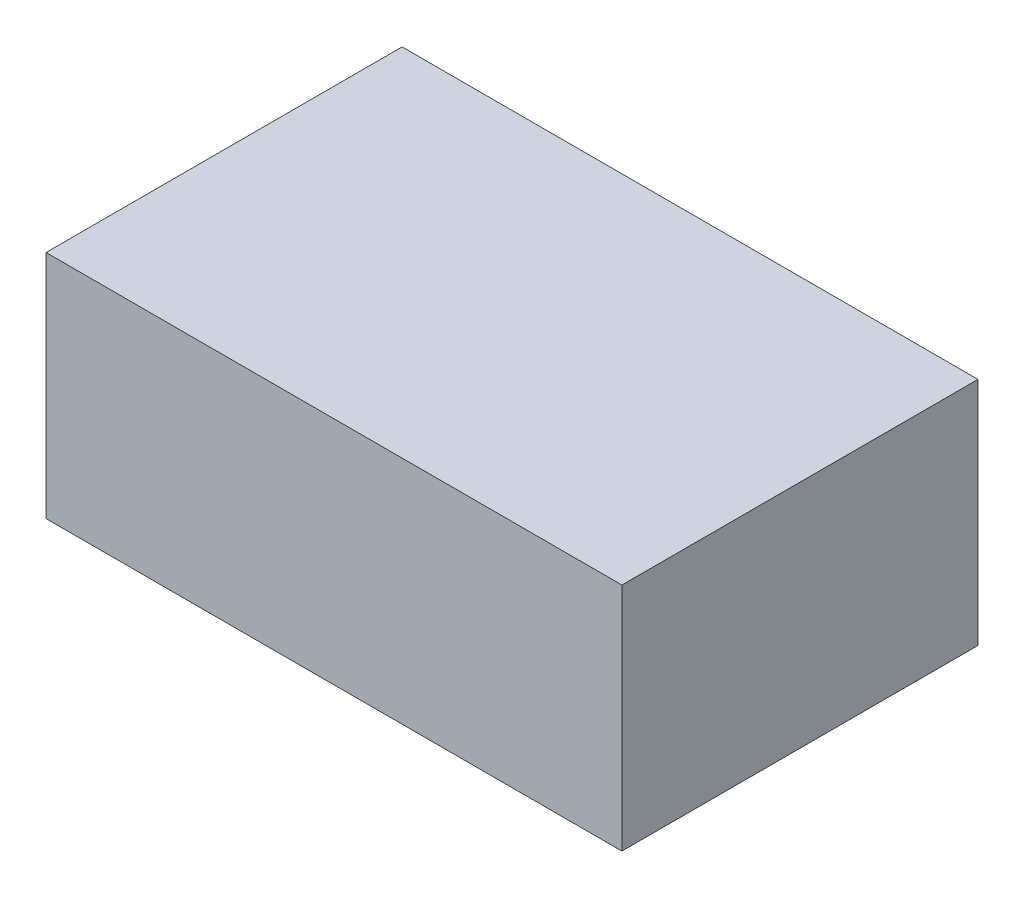
ISO-10303-21;
HEADER;
FILE_DESCRIPTION(('STEP AP214'),'2;1');
FILE_NAME('part.step','',(''),(''),'','','');
FILE_SCHEMA(('AUTOMOTIVE_DESIGN { 1 0 10303 214 1 1 1 1 }'));
ENDSEC;
DATA;
#1=APPLICATION_CONTEXT('core data for automotive mechanical design processes');
#2=APPLICATION_PROTOCOL_DEFINITION('international standard','automotive_design',2000,#1);
#3=PRODUCT_CONTEXT('',#1,'mechanical');
#4=PRODUCT('Part','Part','',(#3));
#5=PRODUCT_RELATED_PRODUCT_CATEGORY('part','',(#4));
#6=PRODUCT_DEFINITION_FORMATION('','',#4);
#7=PRODUCT_DEFINITION_CONTEXT('part definition',#1,'design');
#8=PRODUCT_DEFINITION('design','',#6,#7);
#9=PRODUCT_DEFINITION_SHAPE('','',#8);
#10=(LENGTH_UNIT() NAMED_UNIT(*) SI_UNIT(.MILLI.,.METRE.));
#11=(NAMED_UNIT(*) PLANE_ANGLE_UNIT() SI_UNIT($,.RADIAN.));
#12=(NAMED_UNIT(*) SI_UNIT($,.STERADIAN.) SOLID_ANGLE_UNIT());
#13=UNCERTAINTY_MEASURE_WITH_UNIT(LENGTH_MEASURE(1.E-05),#10,'distance_accuracy_value','');
#14=(GEOMETRIC_REPRESENTATION_CONTEXT(3) GLOBAL_UNCERTAINTY_ASSIGNED_CONTEXT((#13)) GLOBAL_UNIT_ASSIGNED_CONTEXT((#10,
#11,#12)) REPRESENTATION_CONTEXT('',''));
#15=CARTESIAN_POINT('',(0.,0.,0.));
#16=DIRECTION('',(0.,0.,1.));
#17=DIRECTION('',(1.,0.,0.));
#18=AXIS2_PLACEMENT_3D('',#15,#16,#17);
#19=CARTESIAN_POINT('',(0.,63.5,-98.1221280754162));
#20=DIRECTION('',(1.,0.,0.));
#21=DIRECTION('',(0.,0.,-1.));
#22=AXIS2_PLACEMENT_3D('',#19,#20,#21);
#23=PLANE('',#22);
#24=DIRECTION('',(0.,0.,1.));
#25=VECTOR('',#24,1.);
#26=CARTESIAN_POINT('',(0.,0.,-98.1221280754162));
#27=LINE('',#26,#25);
#28=CARTESIAN_POINT('',(0.,0.,-98.1221280754162));
#29=VERTEX_POINT('',#28);
#30=CARTESIAN_POINT('',(0.,0.,0.));
#31=VERTEX_POINT('',#30);
#32=EDGE_CURVE('E101',#29,#31,#27,.T.);
#33=ORIENTED_EDGE('',*,*,#32,.T.);
#34=DIRECTION('',(0.,-1.,0.));
#35=VECTOR('',#34,1.);
#36=CARTESIAN_POINT('',(0.,63.5,0.));
#37=LINE('',#36,#35);
#38=CARTESIAN_POINT('',(0.,63.5,0.));
#39=VERTEX_POINT('',#38);
#40=EDGE_CURVE('E11',#39,#31,#37,.T.);
#41=ORIENTED_EDGE('',*,*,#40,.F.);
#42=DIRECTION('',(0.,0.,1.));
#43=VECTOR('',#42,1.);
#44=CARTESIAN_POINT('',(0.,63.5,-98.1221280754162));
#45=LINE('',#44,#43);
#46=CARTESIAN_POINT('',(0.,63.5,-98.1221280754162));
#47=VERTEX_POINT('',#46);
#48=EDGE_CURVE('E89',#47,#39,#45,.T.);
#49=ORIENTED_EDGE('',*,*,#48,.F.);
#50=DIRECTION('',(0.,-1.,0.));
#51=VECTOR('',#50,1.);
#52=CARTESIAN_POINT('',(0.,63.5,-98.1221280754162));
#53=LINE('',#52,#51);
#54=EDGE_CURVE('E97',#47,#29,#53,.T.);
#55=ORIENTED_EDGE('',*,*,#54,.T.);
#56=EDGE_LOOP('',(#33,#41,#49,#55));
#57=FACE_BOUND('',#56,.T.);
#58=ADVANCED_FACE('F38',(#57),#23,.F.);
#59=CARTESIAN_POINT('',(0.,63.5,0.));
#60=DIRECTION('',(0.,0.,-1.));
#61=DIRECTION('',(-1.,0.,0.));
#62=AXIS2_PLACEMENT_3D('',#59,#60,#61);
#63=PLANE('',#62);
#64=DIRECTION('',(1.,0.,0.));
#65=VECTOR('',#64,1.);
#66=CARTESIAN_POINT('',(0.,0.,0.));
#67=LINE('',#66,#65);
#68=CARTESIAN_POINT('',(158.685463524729,0.,0.));
#69=VERTEX_POINT('',#68);
#70=EDGE_CURVE('E93',#31,#69,#67,.T.);
#71=ORIENTED_EDGE('',*,*,#70,.T.);
#72=DIRECTION('',(0.,-1.,0.));
#73=VECTOR('',#72,1.);
#74=CARTESIAN_POINT('',(158.685463524729,63.5,0.));
#75=LINE('',#74,#73);
#76=CARTESIAN_POINT('',(158.685463524729,63.5,0.));
#77=VERTEX_POINT('',#76);
#78=EDGE_CURVE('E46',#77,#69,#75,.T.);
#79=ORIENTED_EDGE('',*,*,#78,.F.);
#80=DIRECTION('',(1.,0.,0.));
#81=VECTOR('',#80,1.);
#82=CARTESIAN_POINT('',(0.,63.5,0.));
#83=LINE('',#82,#81);
#84=EDGE_CURVE('E84',#39,#77,#83,.T.);
#85=ORIENTED_EDGE('',*,*,#84,.F.);
#86=ORIENTED_EDGE('',*,*,#40,.T.);
#87=EDGE_LOOP('',(#71,#79,#85,#86));
#88=FACE_BOUND('',#87,.T.);
#89=ADVANCED_FACE('F92',(#88),#63,.F.);
#90=CARTESIAN_POINT('',(158.685463524729,63.5,-98.1221280754162));
#91=DIRECTION('',(-1.,0.,0.));
#92=DIRECTION('',(0.,0.,1.));
#93=AXIS2_PLACEMENT_3D('',#90,#91,#92);
#94=PLANE('',#93);
#95=DIRECTION('',(0.,0.,-1.));
#96=VECTOR('',#95,1.);
#97=CARTESIAN_POINT('',(158.685463524729,0.,-98.1221280754162));
#98=LINE('',#97,#96);
#99=CARTESIAN_POINT('',(158.685463524729,0.,-98.1221280754162));
#100=VERTEX_POINT('',#99);
#101=EDGE_CURVE('E71',#69,#100,#98,.T.);
#102=ORIENTED_EDGE('',*,*,#101,.T.);
#103=DIRECTION('',(0.,-1.,0.));
#104=VECTOR('',#103,1.);
#105=CARTESIAN_POINT('',(158.685463524729,63.5,-98.1221280754162));
#106=LINE('',#105,#104);
#107=CARTESIAN_POINT('',(158.685463524729,63.5,-98.1221280754162));
#108=VERTEX_POINT('',#107);
#109=EDGE_CURVE('E94',#108,#100,#106,.T.);
#110=ORIENTED_EDGE('',*,*,#109,.F.);
#111=DIRECTION('',(0.,0.,-1.));
#112=VECTOR('',#111,1.);
#113=CARTESIAN_POINT('',(158.685463524729,63.5,-98.1221280754162));
#114=LINE('',#113,#112);
#115=EDGE_CURVE('E87',#77,#108,#114,.T.);
#116=ORIENTED_EDGE('',*,*,#115,.F.);
#117=ORIENTED_EDGE('',*,*,#78,.T.);
#118=EDGE_LOOP('',(#102,#110,#116,#117));
#119=FACE_BOUND('',#118,.T.);
#120=ADVANCED_FACE('F95',(#119),#94,.F.);
#121=CARTESIAN_POINT('',(0.,63.5,-98.1221280754162));
#122=DIRECTION('',(0.,0.,1.));
#123=DIRECTION('',(1.,0.,0.));
#124=AXIS2_PLACEMENT_3D('',#121,#122,#123);
#125=PLANE('',#124);
#126=DIRECTION('',(-1.,0.,0.));
#127=VECTOR('',#126,1.);
#128=CARTESIAN_POINT('',(0.,0.,-98.1221280754162));
#129=LINE('',#128,#127);
#130=EDGE_CURVE('E77',#100,#29,#129,.T.);
#131=ORIENTED_EDGE('',*,*,#130,.T.);
#132=ORIENTED_EDGE('',*,*,#54,.F.);
#133=DIRECTION('',(-1.,0.,0.));
#134=VECTOR('',#133,1.);
#135=CARTESIAN_POINT('',(0.,63.5,-98.1221280754162));
#136=LINE('',#135,#134);
#137=EDGE_CURVE('E54',#108,#47,#136,.T.);
#138=ORIENTED_EDGE('',*,*,#137,.F.);
#139=ORIENTED_EDGE('',*,*,#109,.T.);
#140=EDGE_LOOP('',(#131,#132,#138,#139));
#141=FACE_BOUND('',#140,.T.);
#142=ADVANCED_FACE('F108',(#141),#125,.F.);
#143=CARTESIAN_POINT('',(0.,63.5,0.));
#144=DIRECTION('',(0.,1.,0.));
#145=DIRECTION('',(0.,0.,1.));
#146=AXIS2_PLACEMENT_3D('',#143,#144,#145);
#147=PLANE('',#146);
#148=ORIENTED_EDGE('',*,*,#48,.T.);
#149=ORIENTED_EDGE('',*,*,#84,.T.);
#150=ORIENTED_EDGE('',*,*,#115,.T.);
#151=ORIENTED_EDGE('',*,*,#137,.T.);
#152=EDGE_LOOP('',(#148,#149,#150,#151));
#153=FACE_BOUND('',#152,.T.);
#154=ADVANCED_FACE('F85',(#153),#147,.T.);
#155=CARTESIAN_POINT('',(0.,0.,0.));
#156=DIRECTION('',(0.,1.,0.));
#157=DIRECTION('',(0.,0.,1.));
#158=AXIS2_PLACEMENT_3D('',#155,#156,#157);
#159=PLANE('',#158);
#160=ORIENTED_EDGE('',*,*,#32,.F.);
#161=ORIENTED_EDGE('',*,*,#130,.F.);
#162=ORIENTED_EDGE('',*,*,#101,.F.);
#163=ORIENTED_EDGE('',*,*,#70,.F.);
#164=EDGE_LOOP('',(#160,#161,#162,#163));
#165=FACE_BOUND('',#164,.T.);
#166=ADVANCED_FACE('F111',(#165),#159,.F.);
#167=CLOSED_SHELL('',(#58,#89,#120,#142,#154,#166));
#168=MANIFOLD_SOLID_BREP('B2',#167);
#169=ADVANCED_BREP_SHAPE_REPRESENTATION('',(#18,#168),#14);
#170=SHAPE_DEFINITION_REPRESENTATION(#9,#169);
ENDSEC;
END-ISO-10303-21;
